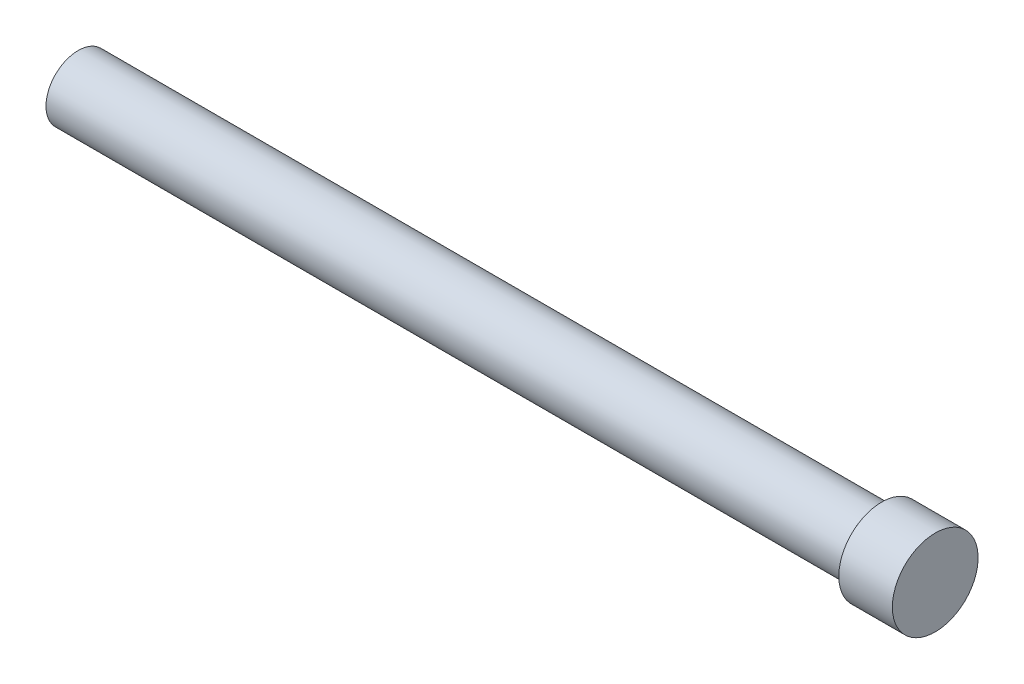
ISO-10303-21;
HEADER;
FILE_DESCRIPTION(('STEP AP214'),'2;1');
FILE_NAME('part.step','',(''),(''),'','','');
FILE_SCHEMA(('AUTOMOTIVE_DESIGN { 1 0 10303 214 1 1 1 1 }'));
ENDSEC;
DATA;
#1=APPLICATION_CONTEXT('core data for automotive mechanical design processes');
#2=APPLICATION_PROTOCOL_DEFINITION('international standard','automotive_design',2000,#1);
#3=PRODUCT_CONTEXT('',#1,'mechanical');
#4=PRODUCT('Part','Part','',(#3));
#5=PRODUCT_RELATED_PRODUCT_CATEGORY('part','',(#4));
#6=PRODUCT_DEFINITION_FORMATION('','',#4);
#7=PRODUCT_DEFINITION_CONTEXT('part definition',#1,'design');
#8=PRODUCT_DEFINITION('design','',#6,#7);
#9=PRODUCT_DEFINITION_SHAPE('','',#8);
#10=(LENGTH_UNIT() NAMED_UNIT(*) SI_UNIT(.MILLI.,.METRE.));
#11=(NAMED_UNIT(*) PLANE_ANGLE_UNIT() SI_UNIT($,.RADIAN.));
#12=(NAMED_UNIT(*) SI_UNIT($,.STERADIAN.) SOLID_ANGLE_UNIT());
#13=UNCERTAINTY_MEASURE_WITH_UNIT(LENGTH_MEASURE(1.E-05),#10,'distance_accuracy_value','');
#14=(GEOMETRIC_REPRESENTATION_CONTEXT(3) GLOBAL_UNCERTAINTY_ASSIGNED_CONTEXT((#13)) GLOBAL_UNIT_ASSIGNED_CONTEXT((#10,
#11,#12)) REPRESENTATION_CONTEXT('',''));
#15=CARTESIAN_POINT('',(0.,0.,0.));
#16=DIRECTION('',(0.,0.,1.));
#17=DIRECTION('',(1.,0.,0.));
#18=AXIS2_PLACEMENT_3D('',#15,#16,#17);
#19=CARTESIAN_POINT('',(-53.6657047724751,3.,0.));
#20=DIRECTION('',(1.,0.,0.));
#21=DIRECTION('',(0.,0.,-1.));
#22=AXIS2_PLACEMENT_3D('',#19,#20,#21);
#23=PLANE('',#22);
#24=CARTESIAN_POINT('',(-53.6657047724751,0.,0.));
#25=DIRECTION('',(-1.,0.,0.));
#26=DIRECTION('',(0.,0.,1.));
#27=AXIS2_PLACEMENT_3D('',#24,#25,#26);
#28=CIRCLE('',#27,3.);
#29=CARTESIAN_POINT('',(-53.6657047724751,0.,3.));
#30=VERTEX_POINT('',#29);
#31=EDGE_CURVE('E45',#30,#30,#28,.T.);
#32=ORIENTED_EDGE('',*,*,#31,.T.);
#33=EDGE_LOOP('',(#32));
#34=FACE_BOUND('',#33,.T.);
#35=ADVANCED_FACE('F31',(#34),#23,.F.);
#36=CARTESIAN_POINT('',(26.3342952275249,0.,0.));
#37=DIRECTION('',(-1.,0.,0.));
#38=DIRECTION('',(0.,0.,1.));
#39=AXIS2_PLACEMENT_3D('',#36,#37,#38);
#40=PLANE('',#39);
#41=CARTESIAN_POINT('',(26.3342952275249,0.,0.));
#42=DIRECTION('',(-1.,0.,0.));
#43=DIRECTION('',(0.,0.,1.));
#44=AXIS2_PLACEMENT_3D('',#41,#42,#43);
#45=CIRCLE('',#44,4.);
#46=CARTESIAN_POINT('',(26.3342952275249,0.,4.));
#47=VERTEX_POINT('',#46);
#48=EDGE_CURVE('E10',#47,#47,#45,.T.);
#49=ORIENTED_EDGE('',*,*,#48,.F.);
#50=EDGE_LOOP('',(#49));
#51=FACE_BOUND('',#50,.T.);
#52=ADVANCED_FACE('F65',(#51),#40,.F.);
#53=CARTESIAN_POINT('',(-53.6657047724751,0.,0.));
#54=DIRECTION('',(-1.,0.,0.));
#55=DIRECTION('',(0.,0.,1.));
#56=AXIS2_PLACEMENT_3D('',#53,#54,#55);
#57=CYLINDRICAL_SURFACE('',#56,4.);
#58=CARTESIAN_POINT('',(21.3342952275249,0.,0.));
#59=DIRECTION('',(-1.,0.,0.));
#60=DIRECTION('',(0.,0.,1.));
#61=AXIS2_PLACEMENT_3D('',#58,#59,#60);
#62=CIRCLE('',#61,4.);
#63=CARTESIAN_POINT('',(21.3342952275249,0.,4.));
#64=VERTEX_POINT('',#63);
#65=EDGE_CURVE('E37',#64,#64,#62,.T.);
#66=ORIENTED_EDGE('',*,*,#65,.F.);
#67=EDGE_LOOP('',(#66));
#68=FACE_BOUND('',#67,.T.);
#69=ORIENTED_EDGE('',*,*,#48,.T.);
#70=EDGE_LOOP('',(#69));
#71=FACE_BOUND('',#70,.T.);
#72=ADVANCED_FACE('F60',(#68,#71),#57,.T.);
#73=CARTESIAN_POINT('',(21.3342952275249,4.,0.));
#74=DIRECTION('',(1.,0.,0.));
#75=DIRECTION('',(0.,0.,-1.));
#76=AXIS2_PLACEMENT_3D('',#73,#74,#75);
#77=PLANE('',#76);
#78=CARTESIAN_POINT('',(21.3342952275249,0.,0.));
#79=DIRECTION('',(-1.,0.,0.));
#80=DIRECTION('',(0.,0.,1.));
#81=AXIS2_PLACEMENT_3D('',#78,#79,#80);
#82=CIRCLE('',#81,3.00000000000001);
#83=CARTESIAN_POINT('',(21.3342952275249,0.,3.00000000000001));
#84=VERTEX_POINT('',#83);
#85=EDGE_CURVE('E41',#84,#84,#82,.T.);
#86=ORIENTED_EDGE('',*,*,#85,.F.);
#87=EDGE_LOOP('',(#86));
#88=FACE_BOUND('',#87,.T.);
#89=ORIENTED_EDGE('',*,*,#65,.T.);
#90=EDGE_LOOP('',(#89));
#91=FACE_BOUND('',#90,.T.);
#92=ADVANCED_FACE('F55',(#88,#91),#77,.F.);
#93=CARTESIAN_POINT('',(-53.6657047724751,0.,0.));
#94=DIRECTION('',(-1.,0.,0.));
#95=DIRECTION('',(0.,0.,1.));
#96=AXIS2_PLACEMENT_3D('',#93,#94,#95);
#97=CYLINDRICAL_SURFACE('',#96,3.);
#98=ORIENTED_EDGE('',*,*,#31,.F.);
#99=EDGE_LOOP('',(#98));
#100=FACE_BOUND('',#99,.T.);
#101=ORIENTED_EDGE('',*,*,#85,.T.);
#102=EDGE_LOOP('',(#101));
#103=FACE_BOUND('',#102,.T.);
#104=ADVANCED_FACE('F52',(#100,#103),#97,.T.);
#105=CLOSED_SHELL('',(#35,#52,#72,#92,#104));
#106=MANIFOLD_SOLID_BREP('B2',#105);
#107=ADVANCED_BREP_SHAPE_REPRESENTATION('',(#18,#106),#14);
#108=SHAPE_DEFINITION_REPRESENTATION(#9,#107);
ENDSEC;
END-ISO-10303-21;
